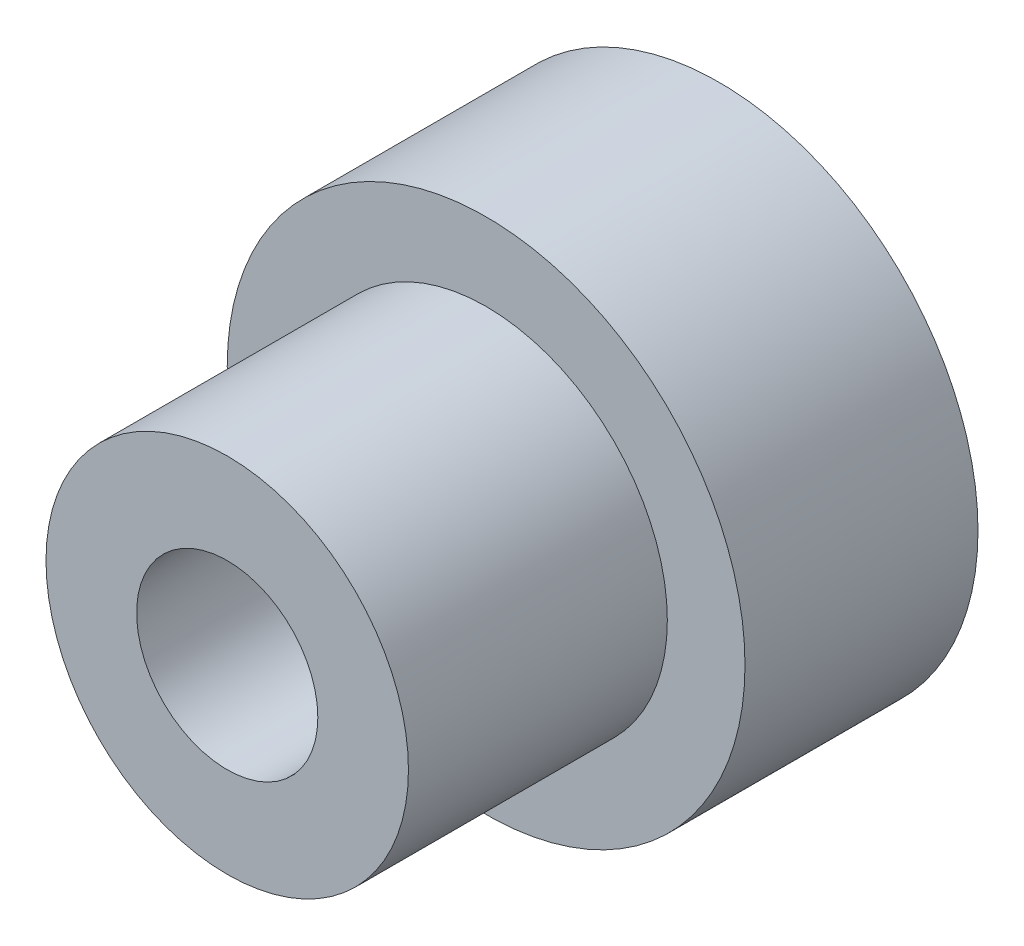
ISO-10303-21;
HEADER;
FILE_DESCRIPTION(('STEP AP214'),'2;1');
FILE_NAME('part.step','',(''),(''),'','','');
FILE_SCHEMA(('AUTOMOTIVE_DESIGN { 1 0 10303 214 1 1 1 1 }'));
ENDSEC;
DATA;
#1=APPLICATION_CONTEXT('core data for automotive mechanical design processes');
#2=APPLICATION_PROTOCOL_DEFINITION('international standard','automotive_design',2000,#1);
#3=PRODUCT_CONTEXT('',#1,'mechanical');
#4=PRODUCT('Part','Part','',(#3));
#5=PRODUCT_RELATED_PRODUCT_CATEGORY('part','',(#4));
#6=PRODUCT_DEFINITION_FORMATION('','',#4);
#7=PRODUCT_DEFINITION_CONTEXT('part definition',#1,'design');
#8=PRODUCT_DEFINITION('design','',#6,#7);
#9=PRODUCT_DEFINITION_SHAPE('','',#8);
#10=(LENGTH_UNIT() NAMED_UNIT(*) SI_UNIT(.MILLI.,.METRE.));
#11=(NAMED_UNIT(*) PLANE_ANGLE_UNIT() SI_UNIT($,.RADIAN.));
#12=(NAMED_UNIT(*) SI_UNIT($,.STERADIAN.) SOLID_ANGLE_UNIT());
#13=UNCERTAINTY_MEASURE_WITH_UNIT(LENGTH_MEASURE(1.E-05),#10,'distance_accuracy_value','');
#14=(GEOMETRIC_REPRESENTATION_CONTEXT(3) GLOBAL_UNCERTAINTY_ASSIGNED_CONTEXT((#13)) GLOBAL_UNIT_ASSIGNED_CONTEXT((#10,
#11,#12)) REPRESENTATION_CONTEXT('',''));
#15=CARTESIAN_POINT('',(0.,0.,0.));
#16=DIRECTION('',(0.,0.,1.));
#17=DIRECTION('',(1.,0.,0.));
#18=AXIS2_PLACEMENT_3D('',#15,#16,#17);
#19=CARTESIAN_POINT('',(0.,0.,-9.));
#20=DIRECTION('',(0.,0.,1.));
#21=DIRECTION('',(1.,0.,0.));
#22=AXIS2_PLACEMENT_3D('',#19,#20,#21);
#23=CYLINDRICAL_SURFACE('',#22,3.5);
#24=CARTESIAN_POINT('',(0.,0.,-9.));
#25=DIRECTION('',(0.,0.,1.));
#26=DIRECTION('',(1.,0.,0.));
#27=AXIS2_PLACEMENT_3D('',#24,#25,#26);
#28=CIRCLE('',#27,3.5);
#29=CARTESIAN_POINT('',(3.5,0.,-9.));
#30=VERTEX_POINT('',#29);
#31=EDGE_CURVE('E63',#30,#30,#28,.T.);
#32=ORIENTED_EDGE('',*,*,#31,.F.);
#33=EDGE_LOOP('',(#32));
#34=FACE_BOUND('',#33,.T.);
#35=CARTESIAN_POINT('',(0.,0.,-5.5));
#36=DIRECTION('',(0.,0.,1.));
#37=DIRECTION('',(1.,0.,0.));
#38=AXIS2_PLACEMENT_3D('',#35,#36,#37);
#39=CIRCLE('',#38,3.5);
#40=CARTESIAN_POINT('',(3.5,0.,-5.5));
#41=VERTEX_POINT('',#40);
#42=EDGE_CURVE('E36',#41,#41,#39,.F.);
#43=ORIENTED_EDGE('',*,*,#42,.F.);
#44=EDGE_LOOP('',(#43));
#45=FACE_BOUND('',#44,.T.);
#46=ADVANCED_FACE('F32',(#34,#45),#23,.F.);
#47=CARTESIAN_POINT('',(0.,0.,10.));
#48=DIRECTION('',(0.,0.,-1.));
#49=DIRECTION('',(-1.,0.,0.));
#50=AXIS2_PLACEMENT_3D('',#47,#48,#49);
#51=CYLINDRICAL_SURFACE('',#50,7.);
#52=CARTESIAN_POINT('',(0.,0.,10.));
#53=DIRECTION('',(0.,0.,1.));
#54=DIRECTION('',(1.,0.,0.));
#55=AXIS2_PLACEMENT_3D('',#52,#53,#54);
#56=CIRCLE('',#55,7.);
#57=CARTESIAN_POINT('',(7.,0.,10.));
#58=VERTEX_POINT('',#57);
#59=EDGE_CURVE('E10',#58,#58,#56,.T.);
#60=ORIENTED_EDGE('',*,*,#59,.F.);
#61=EDGE_LOOP('',(#60));
#62=FACE_BOUND('',#61,.T.);
#63=CARTESIAN_POINT('',(0.,0.,0.));
#64=DIRECTION('',(0.,0.,-1.));
#65=DIRECTION('',(-1.,0.,0.));
#66=AXIS2_PLACEMENT_3D('',#63,#64,#65);
#67=CIRCLE('',#66,7.);
#68=CARTESIAN_POINT('',(-7.,0.,0.));
#69=VERTEX_POINT('',#68);
#70=EDGE_CURVE('E40',#69,#69,#67,.T.);
#71=ORIENTED_EDGE('',*,*,#70,.F.);
#72=EDGE_LOOP('',(#71));
#73=FACE_BOUND('',#72,.T.);
#74=ADVANCED_FACE('F34',(#62,#73),#51,.T.);
#75=CARTESIAN_POINT('',(0.,0.,10.));
#76=DIRECTION('',(0.,0.,1.));
#77=DIRECTION('',(1.,0.,0.));
#78=AXIS2_PLACEMENT_3D('',#75,#76,#77);
#79=PLANE('',#78);
#80=CARTESIAN_POINT('',(0.,0.,10.));
#81=DIRECTION('',(0.,0.,1.));
#82=DIRECTION('',(1.,0.,0.));
#83=AXIS2_PLACEMENT_3D('',#80,#81,#82);
#84=CIRCLE('',#83,3.5);
#85=CARTESIAN_POINT('',(3.5,0.,10.));
#86=VERTEX_POINT('',#85);
#87=EDGE_CURVE('E54',#86,#86,#84,.T.);
#88=ORIENTED_EDGE('',*,*,#87,.F.);
#89=EDGE_LOOP('',(#88));
#90=FACE_BOUND('',#89,.T.);
#91=ORIENTED_EDGE('',*,*,#59,.T.);
#92=EDGE_LOOP('',(#91));
#93=FACE_BOUND('',#92,.T.);
#94=ADVANCED_FACE('F78',(#90,#93),#79,.T.);
#95=CARTESIAN_POINT('',(0.,0.,0.));
#96=DIRECTION('',(0.,0.,-1.));
#97=DIRECTION('',(-1.,0.,0.));
#98=AXIS2_PLACEMENT_3D('',#95,#96,#97);
#99=PLANE('',#98);
#100=CARTESIAN_POINT('',(0.,0.,0.));
#101=DIRECTION('',(0.,0.,-1.));
#102=DIRECTION('',(-1.,0.,0.));
#103=AXIS2_PLACEMENT_3D('',#100,#101,#102);
#104=CIRCLE('',#103,10.);
#105=CARTESIAN_POINT('',(-10.,0.,0.));
#106=VERTEX_POINT('',#105);
#107=EDGE_CURVE('E66',#106,#106,#104,.T.);
#108=ORIENTED_EDGE('',*,*,#107,.F.);
#109=EDGE_LOOP('',(#108));
#110=FACE_BOUND('',#109,.T.);
#111=ORIENTED_EDGE('',*,*,#70,.T.);
#112=EDGE_LOOP('',(#111));
#113=FACE_BOUND('',#112,.T.);
#114=ADVANCED_FACE('F75',(#110,#113),#99,.F.);
#115=CARTESIAN_POINT('',(0.,0.,-9.));
#116=DIRECTION('',(0.,0.,1.));
#117=DIRECTION('',(1.,0.,0.));
#118=AXIS2_PLACEMENT_3D('',#115,#116,#117);
#119=CYLINDRICAL_SURFACE('',#118,10.);
#120=CARTESIAN_POINT('',(0.,0.,-9.));
#121=DIRECTION('',(0.,0.,-1.));
#122=DIRECTION('',(-1.,0.,0.));
#123=AXIS2_PLACEMENT_3D('',#120,#121,#122);
#124=CIRCLE('',#123,10.);
#125=CARTESIAN_POINT('',(-10.,0.,-9.));
#126=VERTEX_POINT('',#125);
#127=EDGE_CURVE('E45',#126,#126,#124,.T.);
#128=ORIENTED_EDGE('',*,*,#127,.F.);
#129=EDGE_LOOP('',(#128));
#130=FACE_BOUND('',#129,.T.);
#131=ORIENTED_EDGE('',*,*,#107,.T.);
#132=EDGE_LOOP('',(#131));
#133=FACE_BOUND('',#132,.T.);
#134=ADVANCED_FACE('F73',(#130,#133),#119,.T.);
#135=CARTESIAN_POINT('',(0.,0.,-9.));
#136=DIRECTION('',(0.,0.,-1.));
#137=DIRECTION('',(-1.,0.,0.));
#138=AXIS2_PLACEMENT_3D('',#135,#136,#137);
#139=PLANE('',#138);
#140=ORIENTED_EDGE('',*,*,#31,.T.);
#141=EDGE_LOOP('',(#140));
#142=FACE_BOUND('',#141,.T.);
#143=ORIENTED_EDGE('',*,*,#127,.T.);
#144=EDGE_LOOP('',(#143));
#145=FACE_BOUND('',#144,.T.);
#146=ADVANCED_FACE('F100',(#142,#145),#139,.T.);
#147=CARTESIAN_POINT('',(0.,0.,-3.));
#148=DIRECTION('',(0.,0.,1.));
#149=DIRECTION('',(1.,0.,0.));
#150=AXIS2_PLACEMENT_3D('',#147,#148,#149);
#151=CIRCLE('',#150,3.5);
#152=CARTESIAN_POINT('',(3.5,0.,-3.));
#153=VERTEX_POINT('',#152);
#154=EDGE_CURVE('E48',#153,#153,#151,.F.);
#155=ORIENTED_EDGE('',*,*,#154,.T.);
#156=EDGE_LOOP('',(#155));
#157=FACE_BOUND('',#156,.T.);
#158=ORIENTED_EDGE('',*,*,#87,.T.);
#159=EDGE_LOOP('',(#158));
#160=FACE_BOUND('',#159,.T.);
#161=ADVANCED_FACE('F91',(#157,#160),#23,.F.);
#162=CARTESIAN_POINT('',(0.,0.,-5.5));
#163=DIRECTION('',(0.,0.,1.));
#164=DIRECTION('',(1.,0.,0.));
#165=AXIS2_PLACEMENT_3D('',#162,#163,#164);
#166=PLANE('',#165);
#167=CARTESIAN_POINT('',(0.,0.,-5.5));
#168=DIRECTION('',(0.,0.,1.));
#169=DIRECTION('',(1.,0.,0.));
#170=AXIS2_PLACEMENT_3D('',#167,#168,#169);
#171=CIRCLE('',#170,5.5);
#172=CARTESIAN_POINT('',(5.5,0.,-5.5));
#173=VERTEX_POINT('',#172);
#174=EDGE_CURVE('E50',#173,#173,#171,.T.);
#175=ORIENTED_EDGE('',*,*,#174,.T.);
#176=EDGE_LOOP('',(#175));
#177=FACE_BOUND('',#176,.T.);
#178=ORIENTED_EDGE('',*,*,#42,.T.);
#179=EDGE_LOOP('',(#178));
#180=FACE_BOUND('',#179,.T.);
#181=ADVANCED_FACE('F99',(#177,#180),#166,.T.);
#182=CARTESIAN_POINT('',(0.,0.,-3.));
#183=DIRECTION('',(0.,0.,1.));
#184=DIRECTION('',(1.,0.,0.));
#185=AXIS2_PLACEMENT_3D('',#182,#183,#184);
#186=PLANE('',#185);
#187=CARTESIAN_POINT('',(0.,0.,-3.));
#188=DIRECTION('',(0.,0.,1.));
#189=DIRECTION('',(1.,0.,0.));
#190=AXIS2_PLACEMENT_3D('',#187,#188,#189);
#191=CIRCLE('',#190,5.5);
#192=CARTESIAN_POINT('',(5.5,0.,-3.));
#193=VERTEX_POINT('',#192);
#194=EDGE_CURVE('E56',#193,#193,#191,.T.);
#195=ORIENTED_EDGE('',*,*,#194,.F.);
#196=EDGE_LOOP('',(#195));
#197=FACE_BOUND('',#196,.T.);
#198=ORIENTED_EDGE('',*,*,#154,.F.);
#199=EDGE_LOOP('',(#198));
#200=FACE_BOUND('',#199,.T.);
#201=ADVANCED_FACE('F105',(#197,#200),#186,.F.);
#202=CARTESIAN_POINT('',(0.,0.,-5.5));
#203=DIRECTION('',(0.,0.,1.));
#204=DIRECTION('',(1.,0.,0.));
#205=AXIS2_PLACEMENT_3D('',#202,#203,#204);
#206=CYLINDRICAL_SURFACE('',#205,5.5);
#207=ORIENTED_EDGE('',*,*,#174,.F.);
#208=EDGE_LOOP('',(#207));
#209=FACE_BOUND('',#208,.T.);
#210=ORIENTED_EDGE('',*,*,#194,.T.);
#211=EDGE_LOOP('',(#210));
#212=FACE_BOUND('',#211,.T.);
#213=ADVANCED_FACE('F154',(#209,#212),#206,.F.);
#214=CLOSED_SHELL('',(#46,#74,#94,#114,#134,#146,#161,#181,#201,#213));
#215=MANIFOLD_SOLID_BREP('B2',#214);
#216=ADVANCED_BREP_SHAPE_REPRESENTATION('',(#18,#215),#14);
#217=SHAPE_DEFINITION_REPRESENTATION(#9,#216);
ENDSEC;
END-ISO-10303-21;
